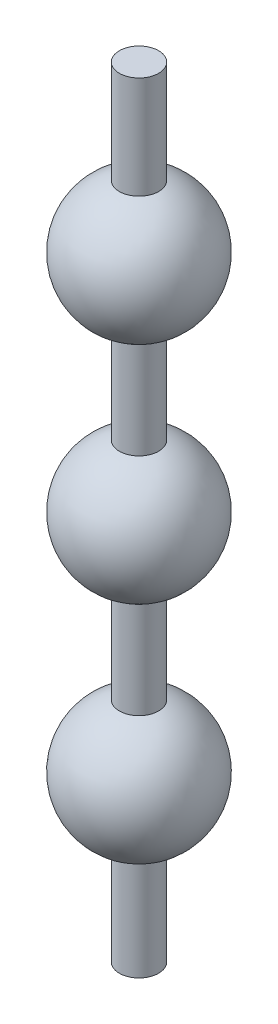
ISO-10303-21;
HEADER;
FILE_DESCRIPTION(('STEP AP214'),'2;1');
FILE_NAME('part.step','',(''),(''),'','','');
FILE_SCHEMA(('AUTOMOTIVE_DESIGN { 1 0 10303 214 1 1 1 1 }'));
ENDSEC;
DATA;
#1=APPLICATION_CONTEXT('core data for automotive mechanical design processes');
#2=APPLICATION_PROTOCOL_DEFINITION('international standard','automotive_design',2000,#1);
#3=PRODUCT_CONTEXT('',#1,'mechanical');
#4=PRODUCT('Part','Part','',(#3));
#5=PRODUCT_RELATED_PRODUCT_CATEGORY('part','',(#4));
#6=PRODUCT_DEFINITION_FORMATION('','',#4);
#7=PRODUCT_DEFINITION_CONTEXT('part definition',#1,'design');
#8=PRODUCT_DEFINITION('design','',#6,#7);
#9=PRODUCT_DEFINITION_SHAPE('','',#8);
#10=(LENGTH_UNIT() NAMED_UNIT(*) SI_UNIT(.MILLI.,.METRE.));
#11=(NAMED_UNIT(*) PLANE_ANGLE_UNIT() SI_UNIT($,.RADIAN.));
#12=(NAMED_UNIT(*) SI_UNIT($,.STERADIAN.) SOLID_ANGLE_UNIT());
#13=UNCERTAINTY_MEASURE_WITH_UNIT(LENGTH_MEASURE(1.E-05),#10,'distance_accuracy_value','');
#14=(GEOMETRIC_REPRESENTATION_CONTEXT(3) GLOBAL_UNCERTAINTY_ASSIGNED_CONTEXT((#13)) GLOBAL_UNIT_ASSIGNED_CONTEXT((#10,
#11,#12)) REPRESENTATION_CONTEXT('',''));
#15=CARTESIAN_POINT('',(0.,0.,0.));
#16=DIRECTION('',(0.,0.,1.));
#17=DIRECTION('',(1.,0.,0.));
#18=AXIS2_PLACEMENT_3D('',#15,#16,#17);
#19=CARTESIAN_POINT('',(0.,16.002,0.));
#20=DIRECTION('',(0.,-1.,0.));
#21=DIRECTION('',(-1.,0.,0.));
#22=AXIS2_PLACEMENT_3D('',#19,#20,#21);
#23=SPHERICAL_SURFACE('',#22,6.35);
#24=CARTESIAN_POINT('',(0.,22.0595139289976,0.));
#25=DIRECTION('',(0.,-1.,0.));
#26=DIRECTION('',(0.,0.,-1.));
#27=AXIS2_PLACEMENT_3D('',#24,#25,#26);
#28=CIRCLE('',#27,1.905);
#29=CARTESIAN_POINT('',(0.,22.0595139289976,-1.905));
#30=VERTEX_POINT('',#29);
#31=EDGE_CURVE('E74',#30,#30,#28,.F.);
#32=ORIENTED_EDGE('',*,*,#31,.F.);
#33=EDGE_LOOP('',(#32));
#34=FACE_BOUND('',#33,.T.);
#35=ADVANCED_FACE('F51',(#34),#23,.T.);
#36=CARTESIAN_POINT('',(0.,32.004,0.));
#37=DIRECTION('',(0.,-1.,0.));
#38=DIRECTION('',(0.,0.,-1.));
#39=AXIS2_PLACEMENT_3D('',#36,#37,#38);
#40=CYLINDRICAL_SURFACE('',#39,1.905);
#41=CARTESIAN_POINT('',(0.,31.7884860710024,0.));
#42=DIRECTION('',(0.,1.,0.));
#43=DIRECTION('',(0.,0.,1.));
#44=AXIS2_PLACEMENT_3D('',#41,#42,#43);
#45=CIRCLE('',#44,1.905);
#46=CARTESIAN_POINT('',(-1.90499999999998,31.7884860710024,0.));
#47=VERTEX_POINT('',#46);
#48=EDGE_CURVE('E68',#47,#47,#45,.T.);
#49=ORIENTED_EDGE('',*,*,#48,.F.);
#50=EDGE_LOOP('',(#49));
#51=FACE_BOUND('',#50,.T.);
#52=ORIENTED_EDGE('',*,*,#31,.T.);
#53=EDGE_LOOP('',(#52));
#54=FACE_BOUND('',#53,.T.);
#55=ADVANCED_FACE('F94',(#51,#54),#40,.T.);
#56=CARTESIAN_POINT('',(0.,37.846,0.));
#57=DIRECTION('',(0.,-1.,0.));
#58=DIRECTION('',(-1.,0.,0.));
#59=AXIS2_PLACEMENT_3D('',#56,#57,#58);
#60=SPHERICAL_SURFACE('',#59,6.35);
#61=CARTESIAN_POINT('',(0.,43.9035139289976,0.));
#62=DIRECTION('',(0.,-1.,0.));
#63=DIRECTION('',(0.,0.,-1.));
#64=AXIS2_PLACEMENT_3D('',#61,#62,#63);
#65=CIRCLE('',#64,1.905);
#66=CARTESIAN_POINT('',(-1.90499999999998,43.9035139289976,0.));
#67=VERTEX_POINT('',#66);
#68=EDGE_CURVE('E63',#67,#67,#65,.F.);
#69=CARTESIAN_POINT('',(-1.90499999999998,43.9035139289976,0.));
#70=CARTESIAN_POINT('',(-2.06478555884066,43.8532792685003,0.));
#71=CARTESIAN_POINT('',(-2.22257229570506,43.7966955604825,0.));
#72=CARTESIAN_POINT('',(-2.53318509894863,43.6712448097469,0.));
#73=CARTESIAN_POINT('',(-2.6860111653278,43.6023777670291,0.));
#74=CARTESIAN_POINT('',(-2.98573960106826,43.4527751072346,0.));
#75=CARTESIAN_POINT('',(-3.13264197042953,43.3720394901579,0.));
#76=CARTESIAN_POINT('',(-3.41960537808117,43.1992093204878,0.));
#77=CARTESIAN_POINT('',(-3.55966641637153,43.1071147678944,0.));
#78=CARTESIAN_POINT('',(-3.83207011542789,42.9121419367906,0.));
#79=CARTESIAN_POINT('',(-3.9644127761939,42.8092636582801,0.));
#80=CARTESIAN_POINT('',(-4.22055157666949,42.5933675540745,0.));
#81=CARTESIAN_POINT('',(-4.34434771637908,42.4803497283794,0.));
#82=CARTESIAN_POINT('',(-4.58261865978131,42.2448817708628,0.));
#83=CARTESIAN_POINT('',(-4.69709346347395,42.1224316390412,0.));
#84=CARTESIAN_POINT('',(-4.91600530057107,41.8688654488281,0.));
#85=CARTESIAN_POINT('',(-5.02044233397556,41.7377493904365,0.));
#86=CARTESIAN_POINT('',(-5.21862500636359,41.4676719341,0.));
#87=CARTESIAN_POINT('',(-5.31237064534714,41.328710536155,0.));
#88=CARTESIAN_POINT('',(-5.48858382019039,41.0438120955995,0.));
#89=CARTESIAN_POINT('',(-5.5710513560501,40.897875052989,0.));
#90=CARTESIAN_POINT('',(-5.72419219939953,40.5999386731887,0.));
#91=CARTESIAN_POINT('',(-5.79486550688927,40.4479393359989,0.));
#92=CARTESIAN_POINT('',(-5.92397558293777,40.1388296586914,0.));
#93=CARTESIAN_POINT('',(-5.98241235149653,39.9817193185736,0.));
#94=CARTESIAN_POINT('',(-6.08668362173832,39.6633709142502,0.));
#95=CARTESIAN_POINT('',(-6.13251812342134,39.5021328500446,0.));
#96=CARTESIAN_POINT('',(-6.21129800357541,39.1765381098864,0.));
#97=CARTESIAN_POINT('',(-6.24424338204646,39.0121814339338,0.));
#98=CARTESIAN_POINT('',(-6.29703882632607,38.681378100519,0.));
#99=CARTESIAN_POINT('',(-6.31688889213464,38.5149314430568,0.));
#100=CARTESIAN_POINT('',(-6.3433694789716,38.1809898570631,0.));
#101=CARTESIAN_POINT('',(-6.35,38.0134949285315,0.));
#102=CARTESIAN_POINT('',(-6.35,37.6785050714685,0.));
#103=CARTESIAN_POINT('',(-6.3433694789716,37.5110101429369,0.));
#104=CARTESIAN_POINT('',(-6.31688889213464,37.1770685569432,0.));
#105=CARTESIAN_POINT('',(-6.29703882632607,37.010621899481,0.));
#106=CARTESIAN_POINT('',(-6.24424338204646,36.6798185660662,0.));
#107=CARTESIAN_POINT('',(-6.21129800357541,36.5154618901136,0.));
#108=CARTESIAN_POINT('',(-6.13251812342134,36.1898671499554,0.));
#109=CARTESIAN_POINT('',(-6.08668362173832,36.0286290857498,0.));
#110=CARTESIAN_POINT('',(-5.98241235149653,35.7102806814264,0.));
#111=CARTESIAN_POINT('',(-5.92397558293777,35.5531703413086,0.));
#112=CARTESIAN_POINT('',(-5.79486550688927,35.2440606640011,0.));
#113=CARTESIAN_POINT('',(-5.72419219939953,35.0920613268113,0.));
#114=CARTESIAN_POINT('',(-5.57105135605009,34.794124947011,0.));
#115=CARTESIAN_POINT('',(-5.48858382019039,34.6481879044005,0.));
#116=CARTESIAN_POINT('',(-5.31237064534714,34.363289463845,0.));
#117=CARTESIAN_POINT('',(-5.21862500636359,34.2243280659,0.));
#118=CARTESIAN_POINT('',(-5.02044233397556,33.9542506095635,0.));
#119=CARTESIAN_POINT('',(-4.91600530057107,33.8231345511719,0.));
#120=CARTESIAN_POINT('',(-4.69709346347395,33.5695683609588,0.));
#121=CARTESIAN_POINT('',(-4.58261865978131,33.4471182291372,0.));
#122=CARTESIAN_POINT('',(-4.34434771637908,33.2116502716206,0.));
#123=CARTESIAN_POINT('',(-4.22055157666949,33.0986324459255,0.));
#124=CARTESIAN_POINT('',(-3.9644127761939,32.8827363417199,0.));
#125=CARTESIAN_POINT('',(-3.8320701154279,32.7798580632094,0.));
#126=CARTESIAN_POINT('',(-3.55966641637153,32.5848852321056,0.));
#127=CARTESIAN_POINT('',(-3.41960537808117,32.4927906795122,0.));
#128=CARTESIAN_POINT('',(-3.13264197042953,32.3199605098421,0.));
#129=CARTESIAN_POINT('',(-2.98573960106826,32.2392248927654,0.));
#130=CARTESIAN_POINT('',(-2.6860111653278,32.0896222329709,0.));
#131=CARTESIAN_POINT('',(-2.53318509894863,32.0207551902531,0.));
#132=CARTESIAN_POINT('',(-2.22257229570506,31.8953044395175,0.));
#133=CARTESIAN_POINT('',(-2.06478555884066,31.8387207314997,0.));
#134=CARTESIAN_POINT('',(-1.90499999999998,31.7884860710024,0.));
#135=B_SPLINE_CURVE_WITH_KNOTS('',3,(#69,#70,#71,#72,#73,#74,#75,#76,#77,#78,#79,#80,#81,#82,
#83,#84,#85,#86,#87,#88,#89,#90,#91,#92,#93,#94,#95,#96,#97,#98,#99,#100,#101,#102,#103,#104,
#105,#106,#107,#108,#109,#110,#111,#112,#113,#114,#115,#116,#117,#118,#119,#120,#121,#122,#123,
#124,#125,#126,#127,#128,#129,#130,#131,#132,#133,#134),.UNSPECIFIED.,.F.,.F.,(4,2,2,2,2,2,2,2,
2,2,2,2,2,2,2,2,2,2,2,2,2,2,2,2,2,2,2,2,2,2,2,2,4),(0.,0.502353803086425,1.00470760617285,
1.50706140925928,2.00941521234571,2.51176901543214,3.01412281851856,3.51647662160499,
4.01883042469142,4.52118422777784,5.02353803086427,5.5258918339507,6.02824563703712,
6.53059944012355,7.03295324320998,7.53530704629641,8.03766084938283,8.54001465246926,
9.04236845555569,9.54472225864211,10.0470760617285,10.549429864815,11.0517836679014,
11.5541374709878,12.0564912740742,12.5588450771607,13.0611988802471,13.5635526833335,
14.06590648642,14.5682602895064,15.0706140925928,15.5729678956792,16.0753216987657),.UNSPECIFIED.);
#136=EDGE_CURVE('BSEAM99',#67,#47,#135,.T.);
#137=ORIENTED_EDGE('',*,*,#68,.F.);
#138=ORIENTED_EDGE('',*,*,#48,.T.);
#139=ORIENTED_EDGE('',*,*,#136,.T.);
#140=ORIENTED_EDGE('',*,*,#136,.F.);
#141=EDGE_LOOP('',(#137,#139,#138,#140));
#142=FACE_BOUND('',#141,.T.);
#143=ADVANCED_FACE('F99',(#142),#60,.T.);
#144=CARTESIAN_POINT('',(0.,53.848,0.));
#145=DIRECTION('',(0.,-1.,0.));
#146=DIRECTION('',(0.,0.,-1.));
#147=AXIS2_PLACEMENT_3D('',#144,#145,#146);
#148=CYLINDRICAL_SURFACE('',#147,1.905);
#149=CARTESIAN_POINT('',(0.,53.6324860710024,0.));
#150=DIRECTION('',(0.,1.,0.));
#151=DIRECTION('',(0.,0.,1.));
#152=AXIS2_PLACEMENT_3D('',#149,#150,#151);
#153=CIRCLE('',#152,1.905);
#154=CARTESIAN_POINT('',(0.,53.6324860710024,1.90499999999998));
#155=VERTEX_POINT('',#154);
#156=EDGE_CURVE('E58',#155,#155,#153,.T.);
#157=ORIENTED_EDGE('',*,*,#156,.F.);
#158=EDGE_LOOP('',(#157));
#159=FACE_BOUND('',#158,.T.);
#160=ORIENTED_EDGE('',*,*,#68,.T.);
#161=EDGE_LOOP('',(#160));
#162=FACE_BOUND('',#161,.T.);
#163=ADVANCED_FACE('F106',(#159,#162),#148,.T.);
#164=CARTESIAN_POINT('',(0.,59.69,0.));
#165=DIRECTION('',(0.,-1.,0.));
#166=DIRECTION('',(0.,0.,1.));
#167=AXIS2_PLACEMENT_3D('',#164,#165,#166);
#168=SPHERICAL_SURFACE('',#167,6.35);
#169=CARTESIAN_POINT('',(0.,65.7475139289976,0.));
#170=DIRECTION('',(0.,-1.,0.));
#171=DIRECTION('',(0.,0.,-1.));
#172=AXIS2_PLACEMENT_3D('',#169,#170,#171);
#173=CIRCLE('',#172,1.905);
#174=CARTESIAN_POINT('',(0.,65.7475139289976,1.90499999999997));
#175=VERTEX_POINT('',#174);
#176=EDGE_CURVE('E11',#175,#175,#173,.F.);
#177=CARTESIAN_POINT('',(0.,65.7475139289976,1.90499999999997));
#178=CARTESIAN_POINT('',(0.,65.6972792685003,2.06478555884065));
#179=CARTESIAN_POINT('',(0.,65.6406955604825,2.22257229570505));
#180=CARTESIAN_POINT('',(0.,65.5152448097469,2.53318509894862));
#181=CARTESIAN_POINT('',(0.,65.4463777670291,2.68601116532779));
#182=CARTESIAN_POINT('',(0.,65.2967751072346,2.98573960106824));
#183=CARTESIAN_POINT('',(0.,65.2160394901579,3.13264197042952));
#184=CARTESIAN_POINT('',(0.,65.0432093204878,3.41960537808116));
#185=CARTESIAN_POINT('',(0.,64.9511147678945,3.55966641637152));
#186=CARTESIAN_POINT('',(0.,64.7561419367906,3.83207011542788));
#187=CARTESIAN_POINT('',(0.,64.6532636582801,3.96441277619389));
#188=CARTESIAN_POINT('',(0.,64.4373675540745,4.22055157666948));
#189=CARTESIAN_POINT('',(0.,64.3243497283795,4.34434771637907));
#190=CARTESIAN_POINT('',(0.,64.0888817708628,4.5826186597813));
#191=CARTESIAN_POINT('',(0.,63.9664316390412,4.69709346347394));
#192=CARTESIAN_POINT('',(0.,63.7128654488281,4.91600530057107));
#193=CARTESIAN_POINT('',(0.,63.5817493904365,5.02044233397555));
#194=CARTESIAN_POINT('',(0.,63.3116719341,5.21862500636359));
#195=CARTESIAN_POINT('',(0.,63.172710536155,5.31237064534713));
#196=CARTESIAN_POINT('',(0.,62.8878120955996,5.48858382019038));
#197=CARTESIAN_POINT('',(0.,62.741875052989,5.57105135605009));
#198=CARTESIAN_POINT('',(0.,62.4439386731887,5.72419219939953));
#199=CARTESIAN_POINT('',(0.,62.2919393359989,5.79486550688926));
#200=CARTESIAN_POINT('',(0.,61.9828296586914,5.92397558293776));
#201=CARTESIAN_POINT('',(0.,61.8257193185736,5.98241235149653));
#202=CARTESIAN_POINT('',(0.,61.5073709142502,6.08668362173832));
#203=CARTESIAN_POINT('',(0.,61.3461328500446,6.13251812342134));
#204=CARTESIAN_POINT('',(0.,61.0205381098864,6.21129800357541));
#205=CARTESIAN_POINT('',(0.,60.8561814339338,6.24424338204646));
#206=CARTESIAN_POINT('',(0.,60.525378100519,6.29703882632607));
#207=CARTESIAN_POINT('',(0.,60.3589314430568,6.31688889213464));
#208=CARTESIAN_POINT('',(0.,60.0249898570631,6.3433694789716));
#209=CARTESIAN_POINT('',(0.,59.8574949285316,6.35));
#210=CARTESIAN_POINT('',(0.,59.5225050714685,6.35));
#211=CARTESIAN_POINT('',(0.,59.3550101429369,6.3433694789716));
#212=CARTESIAN_POINT('',(0.,59.0210685569432,6.31688889213464));
#213=CARTESIAN_POINT('',(0.,58.854621899481,6.29703882632607));
#214=CARTESIAN_POINT('',(0.,58.5238185660662,6.24424338204646));
#215=CARTESIAN_POINT('',(0.,58.3594618901136,6.21129800357541));
#216=CARTESIAN_POINT('',(0.,58.0338671499554,6.13251812342134));
#217=CARTESIAN_POINT('',(0.,57.8726290857498,6.08668362173832));
#218=CARTESIAN_POINT('',(0.,57.5542806814264,5.98241235149653));
#219=CARTESIAN_POINT('',(0.,57.3971703413086,5.92397558293777));
#220=CARTESIAN_POINT('',(0.,57.0880606640011,5.79486550688927));
#221=CARTESIAN_POINT('',(0.,56.9360613268113,5.72419219939954));
#222=CARTESIAN_POINT('',(0.,56.638124947011,5.5710513560501));
#223=CARTESIAN_POINT('',(0.,56.4921879044005,5.48858382019039));
#224=CARTESIAN_POINT('',(0.,56.207289463845,5.31237064534714));
#225=CARTESIAN_POINT('',(0.,56.0683280659,5.21862500636359));
#226=CARTESIAN_POINT('',(0.,55.7982506095635,5.02044233397556));
#227=CARTESIAN_POINT('',(0.,55.6671345511719,4.91600530057108));
#228=CARTESIAN_POINT('',(0.,55.4135683609588,4.69709346347395));
#229=CARTESIAN_POINT('',(0.,55.2911182291372,4.58261865978131));
#230=CARTESIAN_POINT('',(0.,55.0556502716206,4.34434771637908));
#231=CARTESIAN_POINT('',(0.,54.9426324459255,4.22055157666949));
#232=CARTESIAN_POINT('',(0.,54.7267363417199,3.9644127761939));
#233=CARTESIAN_POINT('',(0.,54.6238580632094,3.8320701154279));
#234=CARTESIAN_POINT('',(0.,54.4288852321056,3.55966641637153));
#235=CARTESIAN_POINT('',(0.,54.3367906795122,3.41960537808117));
#236=CARTESIAN_POINT('',(0.,54.1639605098421,3.13264197042954));
#237=CARTESIAN_POINT('',(0.,54.0832248927654,2.98573960106826));
#238=CARTESIAN_POINT('',(0.,53.9336222329709,2.6860111653278));
#239=CARTESIAN_POINT('',(0.,53.8647551902531,2.53318509894863));
#240=CARTESIAN_POINT('',(0.,53.7393044395175,2.22257229570506));
#241=CARTESIAN_POINT('',(0.,53.6827207314997,2.06478555884066));
#242=CARTESIAN_POINT('',(0.,53.6324860710024,1.90499999999998));
#243=B_SPLINE_CURVE_WITH_KNOTS('',3,(#177,#178,#179,#180,#181,#182,#183,#184,#185,#186,#187,
#188,#189,#190,#191,#192,#193,#194,#195,#196,#197,#198,#199,#200,#201,#202,#203,#204,#205,#206,
#207,#208,#209,#210,#211,#212,#213,#214,#215,#216,#217,#218,#219,#220,#221,#222,#223,#224,#225,
#226,#227,#228,#229,#230,#231,#232,#233,#234,#235,#236,#237,#238,#239,#240,#241,#242),
.UNSPECIFIED.,.F.,.F.,(4,2,2,2,2,2,2,2,2,2,2,2,2,2,2,2,2,2,2,2,2,2,2,2,2,2,2,2,2,2,2,2,4),(0.,
0.502353803086429,1.00470760617286,1.50706140925928,2.00941521234571,2.51176901543214,
3.01412281851857,3.516476621605,4.01883042469142,4.52118422777785,5.02353803086428,
5.52589183395071,6.02824563703713,6.53059944012356,7.03295324320999,7.53530704629641,
8.03766084938284,8.54001465246927,9.0423684555557,9.54472225864212,10.0470760617285,
10.549429864815,11.0517836679014,11.5541374709878,12.0564912740743,12.5588450771607,
13.0611988802471,13.5635526833335,14.06590648642,14.5682602895064,15.0706140925928,
15.5729678956793,16.0753216987657),.UNSPECIFIED.);
#244=EDGE_CURVE('BSEAM91',#175,#155,#243,.T.);
#245=ORIENTED_EDGE('',*,*,#176,.F.);
#246=ORIENTED_EDGE('',*,*,#156,.T.);
#247=ORIENTED_EDGE('',*,*,#244,.T.);
#248=ORIENTED_EDGE('',*,*,#244,.F.);
#249=EDGE_LOOP('',(#245,#247,#246,#248));
#250=FACE_BOUND('',#249,.T.);
#251=ADVANCED_FACE('F91',(#250),#168,.T.);
#252=CARTESIAN_POINT('',(0.,75.692,0.));
#253=DIRECTION('',(0.,-1.,0.));
#254=DIRECTION('',(0.,0.,-1.));
#255=AXIS2_PLACEMENT_3D('',#252,#253,#254);
#256=CYLINDRICAL_SURFACE('',#255,1.905);
#257=ORIENTED_EDGE('',*,*,#176,.T.);
#258=EDGE_LOOP('',(#257));
#259=FACE_BOUND('',#258,.T.);
#260=CARTESIAN_POINT('',(0.,75.692,0.));
#261=DIRECTION('',(0.,-1.,0.));
#262=DIRECTION('',(0.,0.,-1.));
#263=AXIS2_PLACEMENT_3D('',#260,#261,#262);
#264=CIRCLE('',#263,1.905);
#265=CARTESIAN_POINT('',(0.,75.692,-1.905));
#266=VERTEX_POINT('',#265);
#267=EDGE_CURVE('E78',#266,#266,#264,.T.);
#268=ORIENTED_EDGE('',*,*,#267,.T.);
#269=EDGE_LOOP('',(#268));
#270=FACE_BOUND('',#269,.T.);
#271=ADVANCED_FACE('F83',(#259,#270),#256,.T.);
#272=CARTESIAN_POINT('',(0.,75.692,0.));
#273=DIRECTION('',(0.,-1.,0.));
#274=DIRECTION('',(0.,0.,-1.));
#275=AXIS2_PLACEMENT_3D('',#272,#273,#274);
#276=PLANE('',#275);
#277=ORIENTED_EDGE('',*,*,#267,.F.);
#278=EDGE_LOOP('',(#277));
#279=FACE_BOUND('',#278,.T.);
#280=ADVANCED_FACE('F85',(#279),#276,.F.);
#281=CLOSED_SHELL('',(#35,#55,#143,#163,#251,#271,#280));
#282=MANIFOLD_SOLID_BREP('B2',#281);
#283=CARTESIAN_POINT('',(0.,10.16,0.));
#284=DIRECTION('',(0.,-1.,0.));
#285=DIRECTION('',(0.,0.,-1.));
#286=AXIS2_PLACEMENT_3D('',#283,#284,#285);
#287=CYLINDRICAL_SURFACE('',#286,1.905);
#288=CARTESIAN_POINT('',(0.,10.16,0.));
#289=DIRECTION('',(0.,1.,0.));
#290=DIRECTION('',(0.,0.,1.));
#291=AXIS2_PLACEMENT_3D('',#288,#289,#290);
#292=CIRCLE('',#291,1.905);
#293=CARTESIAN_POINT('',(0.,10.16,1.905));
#294=VERTEX_POINT('',#293);
#295=EDGE_CURVE('E50',#294,#294,#292,.T.);
#296=ORIENTED_EDGE('',*,*,#295,.F.);
#297=EDGE_LOOP('',(#296));
#298=FACE_BOUND('',#297,.T.);
#299=CARTESIAN_POINT('',(0.,0.,0.));
#300=DIRECTION('',(0.,1.,0.));
#301=DIRECTION('',(0.,0.,1.));
#302=AXIS2_PLACEMENT_3D('',#299,#300,#301);
#303=CIRCLE('',#302,1.905);
#304=CARTESIAN_POINT('',(0.,0.,1.905));
#305=VERTEX_POINT('',#304);
#306=EDGE_CURVE('E161',#305,#305,#303,.T.);
#307=ORIENTED_EDGE('',*,*,#306,.T.);
#308=EDGE_LOOP('',(#307));
#309=FACE_BOUND('',#308,.T.);
#310=ADVANCED_FACE('F158',(#298,#309),#287,.T.);
#311=CARTESIAN_POINT('',(0.,10.16,0.));
#312=DIRECTION('',(0.,1.,0.));
#313=DIRECTION('',(0.,0.,1.));
#314=AXIS2_PLACEMENT_3D('',#311,#312,#313);
#315=PLANE('',#314);
#316=ORIENTED_EDGE('',*,*,#295,.T.);
#317=EDGE_LOOP('',(#316));
#318=FACE_BOUND('',#317,.T.);
#319=ADVANCED_FACE('F173',(#318),#315,.T.);
#320=CARTESIAN_POINT('',(0.,0.,0.));
#321=DIRECTION('',(0.,1.,0.));
#322=DIRECTION('',(0.,0.,1.));
#323=AXIS2_PLACEMENT_3D('',#320,#321,#322);
#324=PLANE('',#323);
#325=ORIENTED_EDGE('',*,*,#306,.F.);
#326=EDGE_LOOP('',(#325));
#327=FACE_BOUND('',#326,.T.);
#328=ADVANCED_FACE('F171',(#327),#324,.F.);
#329=CLOSED_SHELL('',(#310,#319,#328));
#330=MANIFOLD_SOLID_BREP('B6',#329);
#331=ADVANCED_BREP_SHAPE_REPRESENTATION('',(#18,#282,#330),#14);
#332=SHAPE_DEFINITION_REPRESENTATION(#9,#331);
ENDSEC;
END-ISO-10303-21;
